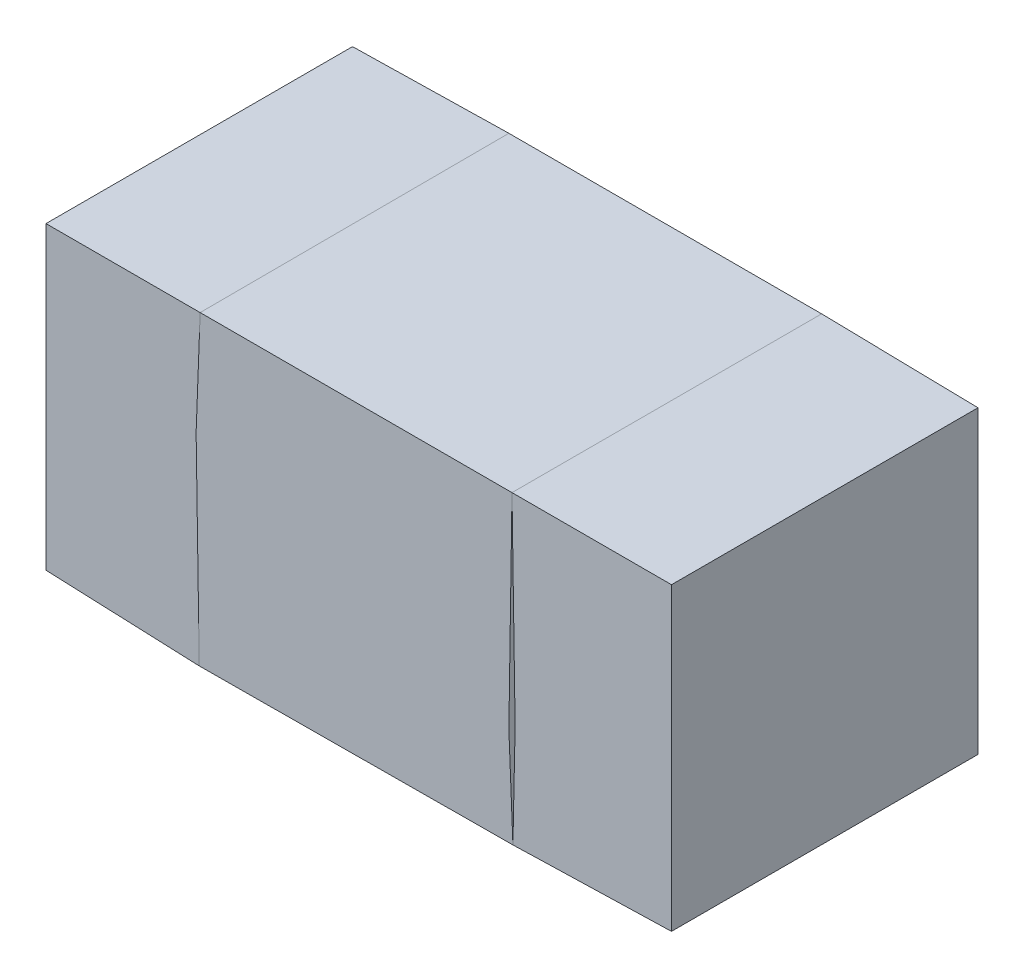
ISO-10303-21;
HEADER;
FILE_DESCRIPTION(('STEP AP214'),'2;1');
FILE_NAME('part.step','',(''),(''),'','','');
FILE_SCHEMA(('AUTOMOTIVE_DESIGN { 1 0 10303 214 1 1 1 1 }'));
ENDSEC;
DATA;
#1=APPLICATION_CONTEXT('core data for automotive mechanical design processes');
#2=APPLICATION_PROTOCOL_DEFINITION('international standard','automotive_design',2000,#1);
#3=PRODUCT_CONTEXT('',#1,'mechanical');
#4=PRODUCT('Part','Part','',(#3));
#5=PRODUCT_RELATED_PRODUCT_CATEGORY('part','',(#4));
#6=PRODUCT_DEFINITION_FORMATION('','',#4);
#7=PRODUCT_DEFINITION_CONTEXT('part definition',#1,'design');
#8=PRODUCT_DEFINITION('design','',#6,#7);
#9=PRODUCT_DEFINITION_SHAPE('','',#8);
#10=(LENGTH_UNIT() NAMED_UNIT(*) SI_UNIT(.MILLI.,.METRE.));
#11=(NAMED_UNIT(*) PLANE_ANGLE_UNIT() SI_UNIT($,.RADIAN.));
#12=(NAMED_UNIT(*) SI_UNIT($,.STERADIAN.) SOLID_ANGLE_UNIT());
#13=UNCERTAINTY_MEASURE_WITH_UNIT(LENGTH_MEASURE(1.E-05),#10,'distance_accuracy_value','');
#14=(GEOMETRIC_REPRESENTATION_CONTEXT(3) GLOBAL_UNCERTAINTY_ASSIGNED_CONTEXT((#13)) GLOBAL_UNIT_ASSIGNED_CONTEXT((#10,
#11,#12)) REPRESENTATION_CONTEXT('',''));
#15=CARTESIAN_POINT('',(0.,0.,0.));
#16=DIRECTION('',(0.,0.,1.));
#17=DIRECTION('',(1.,0.,0.));
#18=AXIS2_PLACEMENT_3D('',#15,#16,#17);
#19=CARTESIAN_POINT('',(0.25,0.25,0.5));
#20=DIRECTION('',(-1.,0.,0.));
#21=DIRECTION('',(0.,-1.,0.));
#22=AXIS2_PLACEMENT_3D('',#19,#20,#21);
#23=PLANE('',#22);
#24=DIRECTION('',(0.,1.,0.));
#25=VECTOR('',#24,1.);
#26=CARTESIAN_POINT('',(0.25,0.25,0.5));
#27=LINE('',#26,#25);
#28=CARTESIAN_POINT('',(0.25,-0.243535533905933,0.493535533905933));
#29=VERTEX_POINT('',#28);
#30=CARTESIAN_POINT('',(0.25,0.245,0.495));
#31=VERTEX_POINT('',#30);
#32=EDGE_CURVE('E268',#29,#31,#27,.T.);
#33=ORIENTED_EDGE('',*,*,#32,.F.);
#34=DIRECTION('',(0.,1.,0.));
#35=VECTOR('',#34,1.);
#36=CARTESIAN_POINT('',(0.25,0.24,0.49));
#37=LINE('',#36,#35);
#38=EDGE_CURVE('E195',#29,#31,#37,.T.);
#39=ORIENTED_EDGE('',*,*,#38,.T.);
#40=EDGE_LOOP('',(#33,#39));
#41=FACE_BOUND('',#40,.T.);
#42=ADVANCED_FACE('F34',(#41),#23,.F.);
#43=CARTESIAN_POINT('',(-0.25,0.25,0.5));
#44=DIRECTION('',(0.,-1.,0.));
#45=DIRECTION('',(0.,0.,-1.));
#46=AXIS2_PLACEMENT_3D('',#43,#44,#45);
#47=PLANE('',#46);
#48=DIRECTION('',(-1.,0.,0.));
#49=VECTOR('',#48,1.);
#50=CARTESIAN_POINT('',(-0.25,0.25,0.));
#51=LINE('',#50,#49);
#52=CARTESIAN_POINT('',(0.25,0.245,0.));
#53=VERTEX_POINT('',#52);
#54=CARTESIAN_POINT('',(-0.25,0.245,0.));
#55=VERTEX_POINT('',#54);
#56=EDGE_CURVE('E255',#53,#55,#51,.T.);
#57=ORIENTED_EDGE('',*,*,#56,.T.);
#58=CARTESIAN_POINT('',(-0.25,0.24,0.49));
#59=DIRECTION('',(0.,0.,-1.));
#60=VECTOR('',#59,1.);
#61=LINE('',#58,#60);
#62=CARTESIAN_POINT('',(-0.25,0.243535533905933,0.493535533905933));
#63=VERTEX_POINT('',#62);
#64=EDGE_CURVE('E43',#63,#55,#61,.T.);
#65=ORIENTED_EDGE('',*,*,#64,.F.);
#66=DIRECTION('',(-1.,0.,0.));
#67=VECTOR('',#66,1.);
#68=CARTESIAN_POINT('',(-0.25,0.25,0.5));
#69=LINE('',#68,#67);
#70=EDGE_CURVE('E206',#31,#63,#69,.T.);
#71=ORIENTED_EDGE('',*,*,#70,.F.);
#72=CARTESIAN_POINT('',(0.25,0.25,0.5));
#73=DIRECTION('',(0.,0.,-1.));
#74=VECTOR('',#73,1.);
#75=LINE('',#72,#74);
#76=EDGE_CURVE('E11',#31,#53,#75,.T.);
#77=ORIENTED_EDGE('',*,*,#76,.T.);
#78=EDGE_LOOP('',(#57,#65,#71,#77));
#79=FACE_BOUND('',#78,.T.);
#80=ADVANCED_FACE('F208',(#79),#47,.F.);
#81=CARTESIAN_POINT('',(-0.25,0.25,0.5));
#82=DIRECTION('',(1.,0.,0.));
#83=DIRECTION('',(0.,1.,0.));
#84=AXIS2_PLACEMENT_3D('',#81,#82,#83);
#85=PLANE('',#84);
#86=DIRECTION('',(0.,-1.,0.));
#87=VECTOR('',#86,1.);
#88=CARTESIAN_POINT('',(-0.25,0.25,0.5));
#89=LINE('',#88,#87);
#90=CARTESIAN_POINT('',(-0.25,-0.245,0.495));
#91=VERTEX_POINT('',#90);
#92=EDGE_CURVE('E241',#63,#91,#89,.T.);
#93=ORIENTED_EDGE('',*,*,#92,.F.);
#94=DIRECTION('',(0.,-1.,0.));
#95=VECTOR('',#94,1.);
#96=CARTESIAN_POINT('',(-0.25,0.24,0.49));
#97=LINE('',#96,#95);
#98=EDGE_CURVE('E121',#63,#91,#97,.T.);
#99=ORIENTED_EDGE('',*,*,#98,.T.);
#100=EDGE_LOOP('',(#93,#99));
#101=FACE_BOUND('',#100,.T.);
#102=ADVANCED_FACE('F217',(#101),#85,.F.);
#103=CARTESIAN_POINT('',(-0.25,-0.25,0.5));
#104=DIRECTION('',(0.,1.,0.));
#105=DIRECTION('',(0.,0.,1.));
#106=AXIS2_PLACEMENT_3D('',#103,#104,#105);
#107=PLANE('',#106);
#108=DIRECTION('',(1.,0.,0.));
#109=VECTOR('',#108,1.);
#110=CARTESIAN_POINT('',(-0.25,-0.25,0.));
#111=LINE('',#110,#109);
#112=CARTESIAN_POINT('',(-0.25,-0.245,0.));
#113=VERTEX_POINT('',#112);
#114=CARTESIAN_POINT('',(0.25,-0.245,0.));
#115=VERTEX_POINT('',#114);
#116=EDGE_CURVE('E267',#113,#115,#111,.T.);
#117=ORIENTED_EDGE('',*,*,#116,.T.);
#118=CARTESIAN_POINT('',(0.25,-0.24,0.49));
#119=DIRECTION('',(0.,0.,-1.));
#120=VECTOR('',#119,1.);
#121=LINE('',#118,#120);
#122=EDGE_CURVE('E262',#29,#115,#121,.T.);
#123=ORIENTED_EDGE('',*,*,#122,.F.);
#124=DIRECTION('',(1.,0.,0.));
#125=VECTOR('',#124,1.);
#126=CARTESIAN_POINT('',(-0.25,-0.25,0.5));
#127=LINE('',#126,#125);
#128=EDGE_CURVE('E249',#91,#29,#127,.T.);
#129=ORIENTED_EDGE('',*,*,#128,.F.);
#130=CARTESIAN_POINT('',(-0.25,-0.25,0.5));
#131=DIRECTION('',(0.,0.,-1.));
#132=VECTOR('',#131,1.);
#133=LINE('',#130,#132);
#134=EDGE_CURVE('E118',#91,#113,#133,.T.);
#135=ORIENTED_EDGE('',*,*,#134,.T.);
#136=EDGE_LOOP('',(#117,#123,#129,#135));
#137=FACE_BOUND('',#136,.T.);
#138=ADVANCED_FACE('F221',(#137),#107,.F.);
#139=CARTESIAN_POINT('',(0.,0.,0.5));
#140=DIRECTION('',(0.,0.,1.));
#141=DIRECTION('',(1.,0.,0.));
#142=AXIS2_PLACEMENT_3D('',#139,#140,#141);
#143=PLANE('',#142);
#144=ORIENTED_EDGE('',*,*,#32,.T.);
#145=ORIENTED_EDGE('',*,*,#70,.T.);
#146=ORIENTED_EDGE('',*,*,#92,.T.);
#147=ORIENTED_EDGE('',*,*,#128,.T.);
#148=EDGE_LOOP('',(#144,#145,#146,#147));
#149=FACE_BOUND('',#148,.T.);
#150=ADVANCED_FACE('F226',(#149),#143,.T.);
#151=CARTESIAN_POINT('',(0.,0.,0.));
#152=DIRECTION('',(0.,0.,1.));
#153=DIRECTION('',(1.,0.,0.));
#154=AXIS2_PLACEMENT_3D('',#151,#152,#153);
#155=PLANE('',#154);
#156=ORIENTED_EDGE('',*,*,#56,.F.);
#157=DIRECTION('',(1.,0.,0.));
#158=VECTOR('',#157,1.);
#159=CARTESIAN_POINT('',(0.25,0.24,0.));
#160=LINE('',#159,#158);
#161=CARTESIAN_POINT('',(0.5,0.24,0.));
#162=VERTEX_POINT('',#161);
#163=EDGE_CURVE('E316',#53,#162,#160,.T.);
#164=ORIENTED_EDGE('',*,*,#163,.T.);
#165=DIRECTION('',(0.,-1.,0.));
#166=VECTOR('',#165,1.);
#167=CARTESIAN_POINT('',(0.5,0.24,0.));
#168=LINE('',#167,#166);
#169=CARTESIAN_POINT('',(0.5,-0.24,0.));
#170=VERTEX_POINT('',#169);
#171=EDGE_CURVE('E196',#162,#170,#168,.T.);
#172=ORIENTED_EDGE('',*,*,#171,.T.);
#173=DIRECTION('',(-1.,0.,0.));
#174=VECTOR('',#173,1.);
#175=CARTESIAN_POINT('',(0.25,-0.24,0.));
#176=LINE('',#175,#174);
#177=EDGE_CURVE('E192',#170,#115,#176,.T.);
#178=ORIENTED_EDGE('',*,*,#177,.T.);
#179=ORIENTED_EDGE('',*,*,#116,.F.);
#180=DIRECTION('',(-1.,0.,0.));
#181=VECTOR('',#180,1.);
#182=CARTESIAN_POINT('',(-0.25,-0.24,0.));
#183=LINE('',#182,#181);
#184=CARTESIAN_POINT('',(-0.5,-0.24,0.));
#185=VERTEX_POINT('',#184);
#186=EDGE_CURVE('E134',#113,#185,#183,.T.);
#187=ORIENTED_EDGE('',*,*,#186,.T.);
#188=DIRECTION('',(0.,1.,0.));
#189=VECTOR('',#188,1.);
#190=CARTESIAN_POINT('',(-0.5,0.24,0.));
#191=LINE('',#190,#189);
#192=CARTESIAN_POINT('',(-0.5,0.24,0.));
#193=VERTEX_POINT('',#192);
#194=EDGE_CURVE('E107',#185,#193,#191,.T.);
#195=ORIENTED_EDGE('',*,*,#194,.T.);
#196=DIRECTION('',(1.,0.,0.));
#197=VECTOR('',#196,1.);
#198=CARTESIAN_POINT('',(-0.25,0.24,0.));
#199=LINE('',#198,#197);
#200=EDGE_CURVE('E123',#193,#55,#199,.T.);
#201=ORIENTED_EDGE('',*,*,#200,.T.);
#202=EDGE_LOOP('',(#156,#164,#172,#178,#179,#187,#195,#201));
#203=FACE_BOUND('',#202,.T.);
#204=ADVANCED_FACE('F171',(#203),#155,.F.);
#205=CARTESIAN_POINT('',(0.25,-0.24,0.49));
#206=DIRECTION('',(0.,-1.,0.));
#207=DIRECTION('',(1.,0.,0.));
#208=AXIS2_PLACEMENT_3D('',#205,#206,#207);
#209=PLANE('',#208);
#210=ORIENTED_EDGE('',*,*,#177,.F.);
#211=DIRECTION('',(0.,0.,-1.));
#212=VECTOR('',#211,1.);
#213=CARTESIAN_POINT('',(0.5,-0.24,0.49));
#214=LINE('',#213,#212);
#215=CARTESIAN_POINT('',(0.5,-0.24,0.49));
#216=VERTEX_POINT('',#215);
#217=EDGE_CURVE('E271',#216,#170,#214,.T.);
#218=ORIENTED_EDGE('',*,*,#217,.F.);
#219=DIRECTION('',(-1.,0.,0.));
#220=VECTOR('',#219,1.);
#221=CARTESIAN_POINT('',(0.25,-0.24,0.49));
#222=LINE('',#221,#220);
#223=EDGE_CURVE('E180',#216,#29,#222,.T.);
#224=ORIENTED_EDGE('',*,*,#223,.T.);
#225=ORIENTED_EDGE('',*,*,#122,.T.);
#226=EDGE_LOOP('',(#210,#218,#224,#225));
#227=FACE_BOUND('',#226,.T.);
#228=ADVANCED_FACE('F166',(#227),#209,.T.);
#229=CARTESIAN_POINT('',(0.5,0.24,0.49));
#230=DIRECTION('',(1.,0.,0.));
#231=DIRECTION('',(0.,1.,0.));
#232=AXIS2_PLACEMENT_3D('',#229,#230,#231);
#233=PLANE('',#232);
#234=ORIENTED_EDGE('',*,*,#171,.F.);
#235=DIRECTION('',(0.,0.,-1.));
#236=VECTOR('',#235,1.);
#237=CARTESIAN_POINT('',(0.5,0.24,0.49));
#238=LINE('',#237,#236);
#239=CARTESIAN_POINT('',(0.5,0.24,0.49));
#240=VERTEX_POINT('',#239);
#241=EDGE_CURVE('E188',#240,#162,#238,.T.);
#242=ORIENTED_EDGE('',*,*,#241,.F.);
#243=DIRECTION('',(0.,-1.,0.));
#244=VECTOR('',#243,1.);
#245=CARTESIAN_POINT('',(0.5,0.24,0.49));
#246=LINE('',#245,#244);
#247=EDGE_CURVE('E189',#240,#216,#246,.T.);
#248=ORIENTED_EDGE('',*,*,#247,.T.);
#249=ORIENTED_EDGE('',*,*,#217,.T.);
#250=EDGE_LOOP('',(#234,#242,#248,#249));
#251=FACE_BOUND('',#250,.T.);
#252=ADVANCED_FACE('F170',(#251),#233,.T.);
#253=CARTESIAN_POINT('',(0.25,0.24,0.49));
#254=DIRECTION('',(0.,1.,0.));
#255=DIRECTION('',(-1.,0.,0.));
#256=AXIS2_PLACEMENT_3D('',#253,#254,#255);
#257=PLANE('',#256);
#258=ORIENTED_EDGE('',*,*,#163,.F.);
#259=ORIENTED_EDGE('',*,*,#76,.F.);
#260=DIRECTION('',(1.,0.,0.));
#261=VECTOR('',#260,1.);
#262=CARTESIAN_POINT('',(0.25,0.24,0.49));
#263=LINE('',#262,#261);
#264=EDGE_CURVE('E58',#31,#240,#263,.T.);
#265=ORIENTED_EDGE('',*,*,#264,.T.);
#266=ORIENTED_EDGE('',*,*,#241,.T.);
#267=EDGE_LOOP('',(#258,#259,#265,#266));
#268=FACE_BOUND('',#267,.T.);
#269=ADVANCED_FACE('F165',(#268),#257,.T.);
#270=CARTESIAN_POINT('',(0.,0.,0.49));
#271=DIRECTION('',(0.,0.,1.));
#272=DIRECTION('',(1.,0.,0.));
#273=AXIS2_PLACEMENT_3D('',#270,#271,#272);
#274=PLANE('',#273);
#275=ORIENTED_EDGE('',*,*,#38,.F.);
#276=ORIENTED_EDGE('',*,*,#223,.F.);
#277=ORIENTED_EDGE('',*,*,#247,.F.);
#278=ORIENTED_EDGE('',*,*,#264,.F.);
#279=EDGE_LOOP('',(#275,#276,#277,#278));
#280=FACE_BOUND('',#279,.T.);
#281=ADVANCED_FACE('F158',(#280),#274,.T.);
#282=CARTESIAN_POINT('',(-0.25,0.24,0.49));
#283=DIRECTION('',(0.,1.,0.));
#284=DIRECTION('',(0.,0.,1.));
#285=AXIS2_PLACEMENT_3D('',#282,#283,#284);
#286=PLANE('',#285);
#287=ORIENTED_EDGE('',*,*,#200,.F.);
#288=DIRECTION('',(0.,0.,-1.));
#289=VECTOR('',#288,1.);
#290=CARTESIAN_POINT('',(-0.5,0.24,0.49));
#291=LINE('',#290,#289);
#292=CARTESIAN_POINT('',(-0.5,0.24,0.49));
#293=VERTEX_POINT('',#292);
#294=EDGE_CURVE('E110',#293,#193,#291,.T.);
#295=ORIENTED_EDGE('',*,*,#294,.F.);
#296=DIRECTION('',(1.,0.,0.));
#297=VECTOR('',#296,1.);
#298=CARTESIAN_POINT('',(-0.25,0.24,0.49));
#299=LINE('',#298,#297);
#300=EDGE_CURVE('E111',#293,#63,#299,.T.);
#301=ORIENTED_EDGE('',*,*,#300,.T.);
#302=ORIENTED_EDGE('',*,*,#64,.T.);
#303=EDGE_LOOP('',(#287,#295,#301,#302));
#304=FACE_BOUND('',#303,.T.);
#305=ADVANCED_FACE('F148',(#304),#286,.T.);
#306=CARTESIAN_POINT('',(-0.5,0.24,0.49));
#307=DIRECTION('',(-1.,0.,0.));
#308=DIRECTION('',(0.,-1.,0.));
#309=AXIS2_PLACEMENT_3D('',#306,#307,#308);
#310=PLANE('',#309);
#311=ORIENTED_EDGE('',*,*,#194,.F.);
#312=DIRECTION('',(0.,0.,-1.));
#313=VECTOR('',#312,1.);
#314=CARTESIAN_POINT('',(-0.5,-0.24,0.49));
#315=LINE('',#314,#313);
#316=CARTESIAN_POINT('',(-0.5,-0.24,0.49));
#317=VERTEX_POINT('',#316);
#318=EDGE_CURVE('E102',#317,#185,#315,.T.);
#319=ORIENTED_EDGE('',*,*,#318,.F.);
#320=DIRECTION('',(0.,1.,0.));
#321=VECTOR('',#320,1.);
#322=CARTESIAN_POINT('',(-0.5,0.24,0.49));
#323=LINE('',#322,#321);
#324=EDGE_CURVE('E104',#317,#293,#323,.T.);
#325=ORIENTED_EDGE('',*,*,#324,.T.);
#326=ORIENTED_EDGE('',*,*,#294,.T.);
#327=EDGE_LOOP('',(#311,#319,#325,#326));
#328=FACE_BOUND('',#327,.T.);
#329=ADVANCED_FACE('F103',(#328),#310,.T.);
#330=CARTESIAN_POINT('',(-0.25,-0.24,0.49));
#331=DIRECTION('',(0.,-1.,0.));
#332=DIRECTION('',(1.,0.,0.));
#333=AXIS2_PLACEMENT_3D('',#330,#331,#332);
#334=PLANE('',#333);
#335=ORIENTED_EDGE('',*,*,#186,.F.);
#336=ORIENTED_EDGE('',*,*,#134,.F.);
#337=DIRECTION('',(-1.,0.,0.));
#338=VECTOR('',#337,1.);
#339=CARTESIAN_POINT('',(-0.25,-0.24,0.49));
#340=LINE('',#339,#338);
#341=EDGE_CURVE('E50',#91,#317,#340,.T.);
#342=ORIENTED_EDGE('',*,*,#341,.T.);
#343=ORIENTED_EDGE('',*,*,#318,.T.);
#344=EDGE_LOOP('',(#335,#336,#342,#343));
#345=FACE_BOUND('',#344,.T.);
#346=ADVANCED_FACE('F116',(#345),#334,.T.);
#347=CARTESIAN_POINT('',(0.,0.,0.49));
#348=DIRECTION('',(0.,0.,-1.));
#349=DIRECTION('',(-1.,0.,0.));
#350=AXIS2_PLACEMENT_3D('',#347,#348,#349);
#351=PLANE('',#350);
#352=ORIENTED_EDGE('',*,*,#98,.F.);
#353=ORIENTED_EDGE('',*,*,#300,.F.);
#354=ORIENTED_EDGE('',*,*,#324,.F.);
#355=ORIENTED_EDGE('',*,*,#341,.F.);
#356=EDGE_LOOP('',(#352,#353,#354,#355));
#357=FACE_BOUND('',#356,.T.);
#358=ADVANCED_FACE('F113',(#357),#351,.F.);
#359=CLOSED_SHELL('',(#42,#80,#102,#138,#150,#204,#228,#252,#269,#281,#305,#329,#346,#358));
#360=MANIFOLD_SOLID_BREP('B2',#359);
#361=ADVANCED_BREP_SHAPE_REPRESENTATION('',(#18,#360),#14);
#362=SHAPE_DEFINITION_REPRESENTATION(#9,#361);
ENDSEC;
END-ISO-10303-21;
